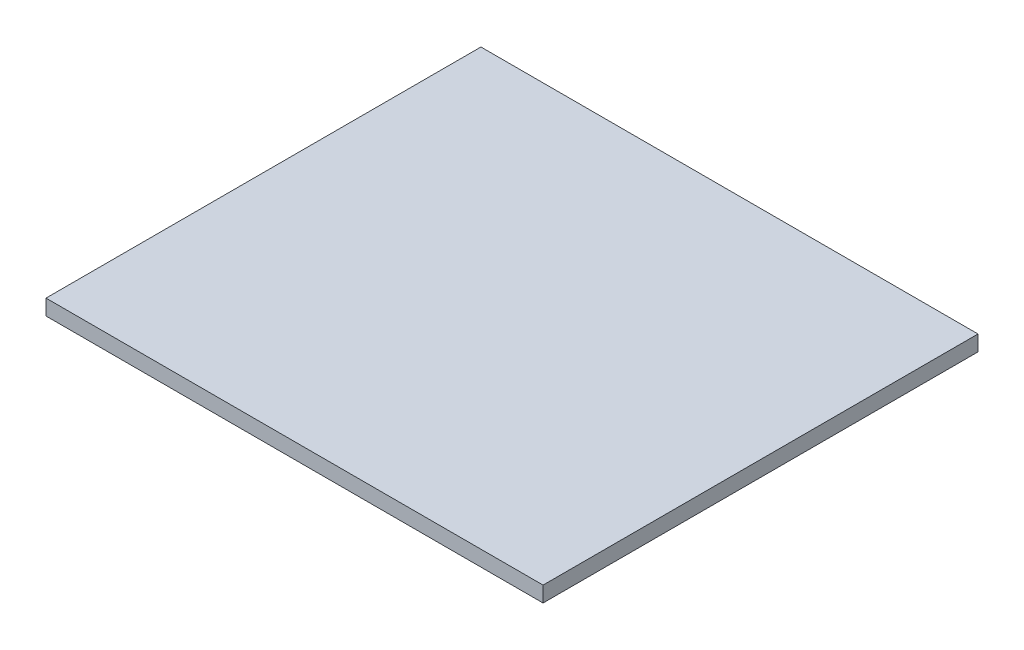
ISO-10303-21;
HEADER;
FILE_DESCRIPTION(('STEP AP214'),'2;1');
FILE_NAME('part.step','',(''),(''),'','','');
FILE_SCHEMA(('AUTOMOTIVE_DESIGN { 1 0 10303 214 1 1 1 1 }'));
ENDSEC;
DATA;
#1=APPLICATION_CONTEXT('core data for automotive mechanical design processes');
#2=APPLICATION_PROTOCOL_DEFINITION('international standard','automotive_design',2000,#1);
#3=PRODUCT_CONTEXT('',#1,'mechanical');
#4=PRODUCT('Part','Part','',(#3));
#5=PRODUCT_RELATED_PRODUCT_CATEGORY('part','',(#4));
#6=PRODUCT_DEFINITION_FORMATION('','',#4);
#7=PRODUCT_DEFINITION_CONTEXT('part definition',#1,'design');
#8=PRODUCT_DEFINITION('design','',#6,#7);
#9=PRODUCT_DEFINITION_SHAPE('','',#8);
#10=(LENGTH_UNIT() NAMED_UNIT(*) SI_UNIT(.MILLI.,.METRE.));
#11=(NAMED_UNIT(*) PLANE_ANGLE_UNIT() SI_UNIT($,.RADIAN.));
#12=(NAMED_UNIT(*) SI_UNIT($,.STERADIAN.) SOLID_ANGLE_UNIT());
#13=UNCERTAINTY_MEASURE_WITH_UNIT(LENGTH_MEASURE(1.E-05),#10,'distance_accuracy_value','');
#14=(GEOMETRIC_REPRESENTATION_CONTEXT(3) GLOBAL_UNCERTAINTY_ASSIGNED_CONTEXT((#13)) GLOBAL_UNIT_ASSIGNED_CONTEXT((#10,
#11,#12)) REPRESENTATION_CONTEXT('',''));
#15=CARTESIAN_POINT('',(0.,0.,0.));
#16=DIRECTION('',(0.,0.,1.));
#17=DIRECTION('',(1.,0.,0.));
#18=AXIS2_PLACEMENT_3D('',#15,#16,#17);
#19=CARTESIAN_POINT('',(203.2,12.7,-177.8));
#20=DIRECTION('',(-1.,0.,0.));
#21=DIRECTION('',(0.,0.,1.));
#22=AXIS2_PLACEMENT_3D('',#19,#20,#21);
#23=PLANE('',#22);
#24=DIRECTION('',(0.,0.,-1.));
#25=VECTOR('',#24,1.);
#26=CARTESIAN_POINT('',(203.2,0.,-177.8));
#27=LINE('',#26,#25);
#28=CARTESIAN_POINT('',(203.2,0.,177.8));
#29=VERTEX_POINT('',#28);
#30=CARTESIAN_POINT('',(203.2,0.,-177.8));
#31=VERTEX_POINT('',#30);
#32=EDGE_CURVE('E108',#29,#31,#27,.T.);
#33=ORIENTED_EDGE('',*,*,#32,.T.);
#34=DIRECTION('',(0.,-1.,0.));
#35=VECTOR('',#34,1.);
#36=CARTESIAN_POINT('',(203.2,12.7,-177.8));
#37=LINE('',#36,#35);
#38=CARTESIAN_POINT('',(203.2,12.7,-177.8));
#39=VERTEX_POINT('',#38);
#40=EDGE_CURVE('E11',#39,#31,#37,.T.);
#41=ORIENTED_EDGE('',*,*,#40,.F.);
#42=DIRECTION('',(0.,0.,-1.));
#43=VECTOR('',#42,1.);
#44=CARTESIAN_POINT('',(203.2,12.7,-177.8));
#45=LINE('',#44,#43);
#46=CARTESIAN_POINT('',(203.2,12.7,177.8));
#47=VERTEX_POINT('',#46);
#48=EDGE_CURVE('E96',#47,#39,#45,.T.);
#49=ORIENTED_EDGE('',*,*,#48,.F.);
#50=DIRECTION('',(0.,-1.,0.));
#51=VECTOR('',#50,1.);
#52=CARTESIAN_POINT('',(203.2,12.7,177.8));
#53=LINE('',#52,#51);
#54=EDGE_CURVE('E104',#47,#29,#53,.T.);
#55=ORIENTED_EDGE('',*,*,#54,.T.);
#56=EDGE_LOOP('',(#33,#41,#49,#55));
#57=FACE_BOUND('',#56,.T.);
#58=ADVANCED_FACE('F45',(#57),#23,.F.);
#59=CARTESIAN_POINT('',(-203.2,12.7,-177.8));
#60=DIRECTION('',(0.,0.,1.));
#61=DIRECTION('',(1.,0.,0.));
#62=AXIS2_PLACEMENT_3D('',#59,#60,#61);
#63=PLANE('',#62);
#64=DIRECTION('',(-1.,0.,0.));
#65=VECTOR('',#64,1.);
#66=CARTESIAN_POINT('',(-203.2,0.,-177.8));
#67=LINE('',#66,#65);
#68=CARTESIAN_POINT('',(-203.2,0.,-177.8));
#69=VERTEX_POINT('',#68);
#70=EDGE_CURVE('E100',#31,#69,#67,.T.);
#71=ORIENTED_EDGE('',*,*,#70,.T.);
#72=DIRECTION('',(0.,-1.,0.));
#73=VECTOR('',#72,1.);
#74=CARTESIAN_POINT('',(-203.2,12.7,-177.8));
#75=LINE('',#74,#73);
#76=CARTESIAN_POINT('',(-203.2,12.7,-177.8));
#77=VERTEX_POINT('',#76);
#78=EDGE_CURVE('E53',#77,#69,#75,.T.);
#79=ORIENTED_EDGE('',*,*,#78,.F.);
#80=DIRECTION('',(-1.,0.,0.));
#81=VECTOR('',#80,1.);
#82=CARTESIAN_POINT('',(-203.2,12.7,-177.8));
#83=LINE('',#82,#81);
#84=EDGE_CURVE('E91',#39,#77,#83,.T.);
#85=ORIENTED_EDGE('',*,*,#84,.F.);
#86=ORIENTED_EDGE('',*,*,#40,.T.);
#87=EDGE_LOOP('',(#71,#79,#85,#86));
#88=FACE_BOUND('',#87,.T.);
#89=ADVANCED_FACE('F99',(#88),#63,.F.);
#90=CARTESIAN_POINT('',(-203.2,12.7,-177.8));
#91=DIRECTION('',(1.,0.,0.));
#92=DIRECTION('',(0.,0.,-1.));
#93=AXIS2_PLACEMENT_3D('',#90,#91,#92);
#94=PLANE('',#93);
#95=DIRECTION('',(0.,0.,1.));
#96=VECTOR('',#95,1.);
#97=CARTESIAN_POINT('',(-203.2,0.,-177.8));
#98=LINE('',#97,#96);
#99=CARTESIAN_POINT('',(-203.2,0.,177.8));
#100=VERTEX_POINT('',#99);
#101=EDGE_CURVE('E78',#69,#100,#98,.T.);
#102=ORIENTED_EDGE('',*,*,#101,.T.);
#103=DIRECTION('',(0.,-1.,0.));
#104=VECTOR('',#103,1.);
#105=CARTESIAN_POINT('',(-203.2,12.7,177.8));
#106=LINE('',#105,#104);
#107=CARTESIAN_POINT('',(-203.2,12.7,177.8));
#108=VERTEX_POINT('',#107);
#109=EDGE_CURVE('E101',#108,#100,#106,.T.);
#110=ORIENTED_EDGE('',*,*,#109,.F.);
#111=DIRECTION('',(0.,0.,1.));
#112=VECTOR('',#111,1.);
#113=CARTESIAN_POINT('',(-203.2,12.7,-177.8));
#114=LINE('',#113,#112);
#115=EDGE_CURVE('E94',#77,#108,#114,.T.);
#116=ORIENTED_EDGE('',*,*,#115,.F.);
#117=ORIENTED_EDGE('',*,*,#78,.T.);
#118=EDGE_LOOP('',(#102,#110,#116,#117));
#119=FACE_BOUND('',#118,.T.);
#120=ADVANCED_FACE('F102',(#119),#94,.F.);
#121=CARTESIAN_POINT('',(-203.2,12.7,177.8));
#122=DIRECTION('',(0.,0.,-1.));
#123=DIRECTION('',(-1.,0.,0.));
#124=AXIS2_PLACEMENT_3D('',#121,#122,#123);
#125=PLANE('',#124);
#126=DIRECTION('',(1.,0.,0.));
#127=VECTOR('',#126,1.);
#128=CARTESIAN_POINT('',(-203.2,0.,177.8));
#129=LINE('',#128,#127);
#130=EDGE_CURVE('E84',#100,#29,#129,.T.);
#131=ORIENTED_EDGE('',*,*,#130,.T.);
#132=ORIENTED_EDGE('',*,*,#54,.F.);
#133=DIRECTION('',(1.,0.,0.));
#134=VECTOR('',#133,1.);
#135=CARTESIAN_POINT('',(-203.2,12.7,177.8));
#136=LINE('',#135,#134);
#137=EDGE_CURVE('E61',#108,#47,#136,.T.);
#138=ORIENTED_EDGE('',*,*,#137,.F.);
#139=ORIENTED_EDGE('',*,*,#109,.T.);
#140=EDGE_LOOP('',(#131,#132,#138,#139));
#141=FACE_BOUND('',#140,.T.);
#142=ADVANCED_FACE('F115',(#141),#125,.F.);
#143=CARTESIAN_POINT('',(0.,12.7,0.));
#144=DIRECTION('',(0.,1.,0.));
#145=DIRECTION('',(0.,0.,1.));
#146=AXIS2_PLACEMENT_3D('',#143,#144,#145);
#147=PLANE('',#146);
#148=ORIENTED_EDGE('',*,*,#48,.T.);
#149=ORIENTED_EDGE('',*,*,#84,.T.);
#150=ORIENTED_EDGE('',*,*,#115,.T.);
#151=ORIENTED_EDGE('',*,*,#137,.T.);
#152=EDGE_LOOP('',(#148,#149,#150,#151));
#153=FACE_BOUND('',#152,.T.);
#154=ADVANCED_FACE('F92',(#153),#147,.T.);
#155=CARTESIAN_POINT('',(0.,0.,0.));
#156=DIRECTION('',(0.,1.,0.));
#157=DIRECTION('',(0.,0.,1.));
#158=AXIS2_PLACEMENT_3D('',#155,#156,#157);
#159=PLANE('',#158);
#160=ORIENTED_EDGE('',*,*,#32,.F.);
#161=ORIENTED_EDGE('',*,*,#130,.F.);
#162=ORIENTED_EDGE('',*,*,#101,.F.);
#163=ORIENTED_EDGE('',*,*,#70,.F.);
#164=EDGE_LOOP('',(#160,#161,#162,#163));
#165=FACE_BOUND('',#164,.T.);
#166=ADVANCED_FACE('F118',(#165),#159,.F.);
#167=CLOSED_SHELL('',(#58,#89,#120,#142,#154,#166));
#168=MANIFOLD_SOLID_BREP('B2',#167);
#169=ADVANCED_BREP_SHAPE_REPRESENTATION('',(#18,#168),#14);
#170=SHAPE_DEFINITION_REPRESENTATION(#9,#169);
ENDSEC;
END-ISO-10303-21;
